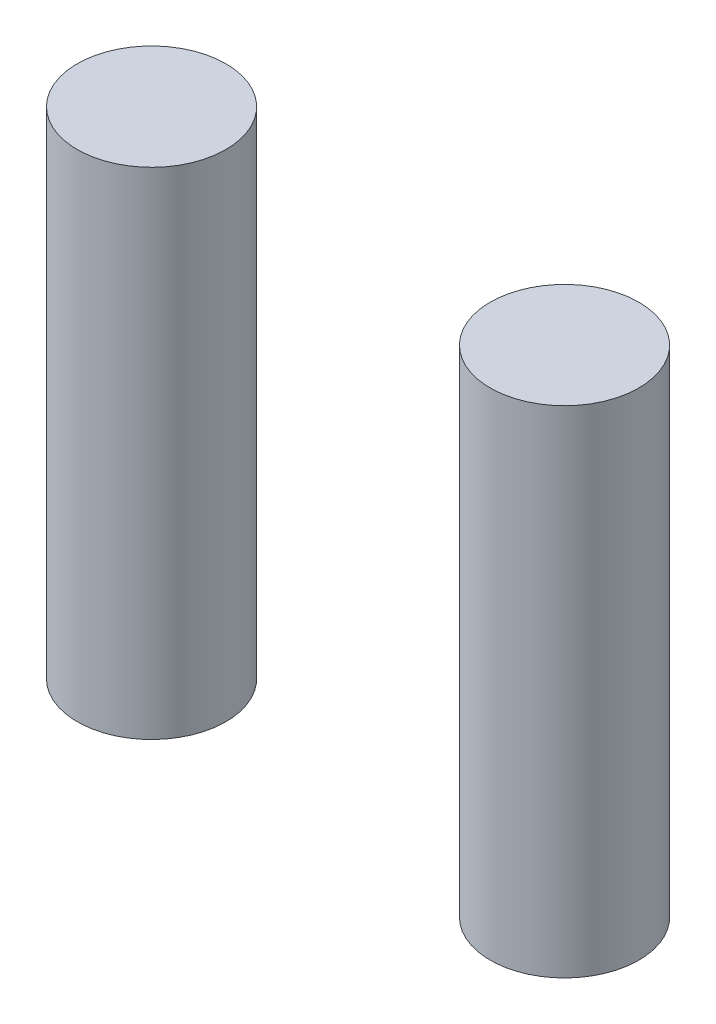
ISO-10303-21;
HEADER;
FILE_DESCRIPTION(('STEP AP214'),'2;1');
FILE_NAME('part.step','',(''),(''),'','','');
FILE_SCHEMA(('AUTOMOTIVE_DESIGN { 1 0 10303 214 1 1 1 1 }'));
ENDSEC;
DATA;
#1=APPLICATION_CONTEXT('core data for automotive mechanical design processes');
#2=APPLICATION_PROTOCOL_DEFINITION('international standard','automotive_design',2000,#1);
#3=PRODUCT_CONTEXT('',#1,'mechanical');
#4=PRODUCT('Part','Part','',(#3));
#5=PRODUCT_RELATED_PRODUCT_CATEGORY('part','',(#4));
#6=PRODUCT_DEFINITION_FORMATION('','',#4);
#7=PRODUCT_DEFINITION_CONTEXT('part definition',#1,'design');
#8=PRODUCT_DEFINITION('design','',#6,#7);
#9=PRODUCT_DEFINITION_SHAPE('','',#8);
#10=(LENGTH_UNIT() NAMED_UNIT(*) SI_UNIT(.MILLI.,.METRE.));
#11=(NAMED_UNIT(*) PLANE_ANGLE_UNIT() SI_UNIT($,.RADIAN.));
#12=(NAMED_UNIT(*) SI_UNIT($,.STERADIAN.) SOLID_ANGLE_UNIT());
#13=UNCERTAINTY_MEASURE_WITH_UNIT(LENGTH_MEASURE(1.E-05),#10,'distance_accuracy_value','');
#14=(GEOMETRIC_REPRESENTATION_CONTEXT(3) GLOBAL_UNCERTAINTY_ASSIGNED_CONTEXT((#13)) GLOBAL_UNIT_ASSIGNED_CONTEXT((#10,
#11,#12)) REPRESENTATION_CONTEXT('',''));
#15=CARTESIAN_POINT('',(0.,0.,0.));
#16=DIRECTION('',(0.,0.,1.));
#17=DIRECTION('',(1.,0.,0.));
#18=AXIS2_PLACEMENT_3D('',#15,#16,#17);
#19=CARTESIAN_POINT('',(6.35,7.62,0.));
#20=DIRECTION('',(0.,-1.,0.));
#21=DIRECTION('',(0.,0.,-1.));
#22=AXIS2_PLACEMENT_3D('',#19,#20,#21);
#23=CYLINDRICAL_SURFACE('',#22,1.143);
#24=CARTESIAN_POINT('',(6.35,7.62,0.));
#25=DIRECTION('',(0.,1.,0.));
#26=DIRECTION('',(0.,0.,1.));
#27=AXIS2_PLACEMENT_3D('',#24,#25,#26);
#28=CIRCLE('',#27,1.143);
#29=CARTESIAN_POINT('',(6.35,7.62,-1.143));
#30=VERTEX_POINT('',#29);
#31=EDGE_CURVE('E11',#30,#30,#28,.T.);
#32=CARTESIAN_POINT('',(6.35,0.,0.));
#33=DIRECTION('',(0.,1.,0.));
#34=DIRECTION('',(0.,0.,1.));
#35=AXIS2_PLACEMENT_3D('',#32,#33,#34);
#36=CIRCLE('',#35,1.143);
#37=CARTESIAN_POINT('',(6.35,0.,-1.143));
#38=VERTEX_POINT('',#37);
#39=EDGE_CURVE('E42',#38,#38,#36,.T.);
#40=CARTESIAN_POINT('',(6.35,7.62,-1.143));
#41=CARTESIAN_POINT('',(6.35,7.540625,-1.143));
#42=CARTESIAN_POINT('',(6.35,7.46125,-1.143));
#43=CARTESIAN_POINT('',(6.35,7.3025,-1.143));
#44=CARTESIAN_POINT('',(6.35,7.223125,-1.143));
#45=CARTESIAN_POINT('',(6.35,7.064375,-1.143));
#46=CARTESIAN_POINT('',(6.35,6.985,-1.143));
#47=CARTESIAN_POINT('',(6.35,6.82625,-1.143));
#48=CARTESIAN_POINT('',(6.35,6.746875,-1.143));
#49=CARTESIAN_POINT('',(6.35,6.588125,-1.143));
#50=CARTESIAN_POINT('',(6.35,6.50875,-1.143));
#51=CARTESIAN_POINT('',(6.35,6.35,-1.143));
#52=CARTESIAN_POINT('',(6.35,6.270625,-1.143));
#53=CARTESIAN_POINT('',(6.35,6.111875,-1.143));
#54=CARTESIAN_POINT('',(6.35,6.0325,-1.143));
#55=CARTESIAN_POINT('',(6.35,5.87375,-1.143));
#56=CARTESIAN_POINT('',(6.35,5.794375,-1.143));
#57=CARTESIAN_POINT('',(6.35,5.635625,-1.143));
#58=CARTESIAN_POINT('',(6.35,5.55625,-1.143));
#59=CARTESIAN_POINT('',(6.35,5.3975,-1.143));
#60=CARTESIAN_POINT('',(6.35,5.318125,-1.143));
#61=CARTESIAN_POINT('',(6.35,5.159375,-1.143));
#62=CARTESIAN_POINT('',(6.35,5.08,-1.143));
#63=CARTESIAN_POINT('',(6.35,4.92125,-1.143));
#64=CARTESIAN_POINT('',(6.35,4.841875,-1.143));
#65=CARTESIAN_POINT('',(6.35,4.683125,-1.143));
#66=CARTESIAN_POINT('',(6.35,4.60375,-1.143));
#67=CARTESIAN_POINT('',(6.35,4.445,-1.143));
#68=CARTESIAN_POINT('',(6.35,4.365625,-1.143));
#69=CARTESIAN_POINT('',(6.35,4.206875,-1.143));
#70=CARTESIAN_POINT('',(6.35,4.1275,-1.143));
#71=CARTESIAN_POINT('',(6.35,3.96875,-1.143));
#72=CARTESIAN_POINT('',(6.35,3.889375,-1.143));
#73=CARTESIAN_POINT('',(6.35,3.730625,-1.143));
#74=CARTESIAN_POINT('',(6.35,3.65125,-1.143));
#75=CARTESIAN_POINT('',(6.35,3.4925,-1.143));
#76=CARTESIAN_POINT('',(6.35,3.413125,-1.143));
#77=CARTESIAN_POINT('',(6.35,3.254375,-1.143));
#78=CARTESIAN_POINT('',(6.35,3.175,-1.143));
#79=CARTESIAN_POINT('',(6.35,3.01625,-1.143));
#80=CARTESIAN_POINT('',(6.35,2.936875,-1.143));
#81=CARTESIAN_POINT('',(6.35,2.778125,-1.143));
#82=CARTESIAN_POINT('',(6.35,2.69875,-1.143));
#83=CARTESIAN_POINT('',(6.35,2.54,-1.143));
#84=CARTESIAN_POINT('',(6.35,2.460625,-1.143));
#85=CARTESIAN_POINT('',(6.35,2.301875,-1.143));
#86=CARTESIAN_POINT('',(6.35,2.2225,-1.143));
#87=CARTESIAN_POINT('',(6.35,2.06375,-1.143));
#88=CARTESIAN_POINT('',(6.35,1.984375,-1.143));
#89=CARTESIAN_POINT('',(6.35,1.825625,-1.143));
#90=CARTESIAN_POINT('',(6.35,1.74625,-1.143));
#91=CARTESIAN_POINT('',(6.35,1.5875,-1.143));
#92=CARTESIAN_POINT('',(6.35,1.508125,-1.143));
#93=CARTESIAN_POINT('',(6.35,1.349375,-1.143));
#94=CARTESIAN_POINT('',(6.35,1.27,-1.143));
#95=CARTESIAN_POINT('',(6.35,1.11125,-1.143));
#96=CARTESIAN_POINT('',(6.35,1.031875,-1.143));
#97=CARTESIAN_POINT('',(6.35,0.873125,-1.143));
#98=CARTESIAN_POINT('',(6.35,0.79375,-1.143));
#99=CARTESIAN_POINT('',(6.35,0.635,-1.143));
#100=CARTESIAN_POINT('',(6.35,0.555625,-1.143));
#101=CARTESIAN_POINT('',(6.35,0.396875,-1.143));
#102=CARTESIAN_POINT('',(6.35,0.3175,-1.143));
#103=CARTESIAN_POINT('',(6.35,0.15875,-1.143));
#104=CARTESIAN_POINT('',(6.35,0.0793749999999999,-1.143));
#105=CARTESIAN_POINT('',(6.35,0.,-1.143));
#106=B_SPLINE_CURVE_WITH_KNOTS('',3,(#40,#41,#42,#43,#44,#45,#46,#47,#48,#49,#50,#51,#52,#53,
#54,#55,#56,#57,#58,#59,#60,#61,#62,#63,#64,#65,#66,#67,#68,#69,#70,#71,#72,#73,#74,#75,#76,#77,
#78,#79,#80,#81,#82,#83,#84,#85,#86,#87,#88,#89,#90,#91,#92,#93,#94,#95,#96,#97,#98,#99,#100,
#101,#102,#103,#104,#105),.UNSPECIFIED.,.F.,.F.,(4,2,2,2,2,2,2,2,2,2,2,2,2,2,2,2,2,2,2,2,2,2,2,
2,2,2,2,2,2,2,2,2,4),(0.,0.238125,0.476249999999999,0.714375,0.952499999999999,1.190625,1.42875,
1.666875,1.905,2.143125,2.38125,2.619375,2.8575,3.095625,3.33375,3.571875,3.81,4.048125,4.28625,
4.524375,4.7625,5.000625,5.23875,5.476875,5.715,5.953125,6.19125,6.429375,6.6675,6.905625,
7.14375,7.381875,7.62),.UNSPECIFIED.);
#107=EDGE_CURVE('BSEAM39',#30,#38,#106,.T.);
#108=ORIENTED_EDGE('',*,*,#31,.F.);
#109=ORIENTED_EDGE('',*,*,#39,.T.);
#110=ORIENTED_EDGE('',*,*,#107,.T.);
#111=ORIENTED_EDGE('',*,*,#107,.F.);
#112=EDGE_LOOP('',(#108,#110,#109,#111));
#113=FACE_BOUND('',#112,.T.);
#114=ADVANCED_FACE('F39',(#113),#23,.T.);
#115=CARTESIAN_POINT('',(6.35,7.62,0.));
#116=DIRECTION('',(0.,1.,0.));
#117=DIRECTION('',(0.,0.,1.));
#118=AXIS2_PLACEMENT_3D('',#115,#116,#117);
#119=PLANE('',#118);
#120=ORIENTED_EDGE('',*,*,#31,.T.);
#121=EDGE_LOOP('',(#120));
#122=FACE_BOUND('',#121,.T.);
#123=ADVANCED_FACE('F54',(#122),#119,.T.);
#124=CARTESIAN_POINT('',(6.35,0.,0.));
#125=DIRECTION('',(0.,1.,0.));
#126=DIRECTION('',(0.,0.,1.));
#127=AXIS2_PLACEMENT_3D('',#124,#125,#126);
#128=PLANE('',#127);
#129=ORIENTED_EDGE('',*,*,#39,.F.);
#130=EDGE_LOOP('',(#129));
#131=FACE_BOUND('',#130,.T.);
#132=ADVANCED_FACE('F52',(#131),#128,.F.);
#133=CLOSED_SHELL('',(#114,#123,#132));
#134=MANIFOLD_SOLID_BREP('B2',#133);
#135=CARTESIAN_POINT('',(0.,7.62,0.));
#136=DIRECTION('',(0.,-1.,0.));
#137=DIRECTION('',(0.,0.,-1.));
#138=AXIS2_PLACEMENT_3D('',#135,#136,#137);
#139=CYLINDRICAL_SURFACE('',#138,1.143);
#140=CARTESIAN_POINT('',(0.,7.62,0.));
#141=DIRECTION('',(0.,1.,0.));
#142=DIRECTION('',(0.,0.,1.));
#143=AXIS2_PLACEMENT_3D('',#140,#141,#142);
#144=CIRCLE('',#143,1.143);
#145=CARTESIAN_POINT('',(0.,7.62,-1.143));
#146=VERTEX_POINT('',#145);
#147=EDGE_CURVE('E38',#146,#146,#144,.T.);
#148=CARTESIAN_POINT('',(0.,0.,0.));
#149=DIRECTION('',(0.,1.,0.));
#150=DIRECTION('',(0.,0.,1.));
#151=AXIS2_PLACEMENT_3D('',#148,#149,#150);
#152=CIRCLE('',#151,1.143);
#153=CARTESIAN_POINT('',(0.,0.,-1.143));
#154=VERTEX_POINT('',#153);
#155=EDGE_CURVE('E83',#154,#154,#152,.T.);
#156=CARTESIAN_POINT('',(0.,7.62,-1.143));
#157=CARTESIAN_POINT('',(0.,7.540625,-1.143));
#158=CARTESIAN_POINT('',(0.,7.46125,-1.143));
#159=CARTESIAN_POINT('',(0.,7.3025,-1.143));
#160=CARTESIAN_POINT('',(0.,7.223125,-1.143));
#161=CARTESIAN_POINT('',(0.,7.064375,-1.143));
#162=CARTESIAN_POINT('',(0.,6.985,-1.143));
#163=CARTESIAN_POINT('',(0.,6.82625,-1.143));
#164=CARTESIAN_POINT('',(0.,6.746875,-1.143));
#165=CARTESIAN_POINT('',(0.,6.588125,-1.143));
#166=CARTESIAN_POINT('',(0.,6.50875,-1.143));
#167=CARTESIAN_POINT('',(0.,6.35,-1.143));
#168=CARTESIAN_POINT('',(0.,6.270625,-1.143));
#169=CARTESIAN_POINT('',(0.,6.111875,-1.143));
#170=CARTESIAN_POINT('',(0.,6.0325,-1.143));
#171=CARTESIAN_POINT('',(0.,5.87375,-1.143));
#172=CARTESIAN_POINT('',(0.,5.794375,-1.143));
#173=CARTESIAN_POINT('',(0.,5.635625,-1.143));
#174=CARTESIAN_POINT('',(0.,5.55625,-1.143));
#175=CARTESIAN_POINT('',(0.,5.3975,-1.143));
#176=CARTESIAN_POINT('',(0.,5.318125,-1.143));
#177=CARTESIAN_POINT('',(0.,5.159375,-1.143));
#178=CARTESIAN_POINT('',(0.,5.08,-1.143));
#179=CARTESIAN_POINT('',(0.,4.92125,-1.143));
#180=CARTESIAN_POINT('',(0.,4.841875,-1.143));
#181=CARTESIAN_POINT('',(0.,4.683125,-1.143));
#182=CARTESIAN_POINT('',(0.,4.60375,-1.143));
#183=CARTESIAN_POINT('',(0.,4.445,-1.143));
#184=CARTESIAN_POINT('',(0.,4.365625,-1.143));
#185=CARTESIAN_POINT('',(0.,4.206875,-1.143));
#186=CARTESIAN_POINT('',(0.,4.1275,-1.143));
#187=CARTESIAN_POINT('',(0.,3.96875,-1.143));
#188=CARTESIAN_POINT('',(0.,3.889375,-1.143));
#189=CARTESIAN_POINT('',(0.,3.730625,-1.143));
#190=CARTESIAN_POINT('',(0.,3.65125,-1.143));
#191=CARTESIAN_POINT('',(0.,3.4925,-1.143));
#192=CARTESIAN_POINT('',(0.,3.413125,-1.143));
#193=CARTESIAN_POINT('',(0.,3.254375,-1.143));
#194=CARTESIAN_POINT('',(0.,3.175,-1.143));
#195=CARTESIAN_POINT('',(0.,3.01625,-1.143));
#196=CARTESIAN_POINT('',(0.,2.936875,-1.143));
#197=CARTESIAN_POINT('',(0.,2.778125,-1.143));
#198=CARTESIAN_POINT('',(0.,2.69875,-1.143));
#199=CARTESIAN_POINT('',(0.,2.54,-1.143));
#200=CARTESIAN_POINT('',(0.,2.460625,-1.143));
#201=CARTESIAN_POINT('',(0.,2.301875,-1.143));
#202=CARTESIAN_POINT('',(0.,2.2225,-1.143));
#203=CARTESIAN_POINT('',(0.,2.06375,-1.143));
#204=CARTESIAN_POINT('',(0.,1.984375,-1.143));
#205=CARTESIAN_POINT('',(0.,1.825625,-1.143));
#206=CARTESIAN_POINT('',(0.,1.74625,-1.143));
#207=CARTESIAN_POINT('',(0.,1.5875,-1.143));
#208=CARTESIAN_POINT('',(0.,1.508125,-1.143));
#209=CARTESIAN_POINT('',(0.,1.349375,-1.143));
#210=CARTESIAN_POINT('',(0.,1.27,-1.143));
#211=CARTESIAN_POINT('',(0.,1.11125,-1.143));
#212=CARTESIAN_POINT('',(0.,1.031875,-1.143));
#213=CARTESIAN_POINT('',(0.,0.873125,-1.143));
#214=CARTESIAN_POINT('',(0.,0.79375,-1.143));
#215=CARTESIAN_POINT('',(0.,0.635,-1.143));
#216=CARTESIAN_POINT('',(0.,0.555625,-1.143));
#217=CARTESIAN_POINT('',(0.,0.396875,-1.143));
#218=CARTESIAN_POINT('',(0.,0.3175,-1.143));
#219=CARTESIAN_POINT('',(0.,0.15875,-1.143));
#220=CARTESIAN_POINT('',(0.,0.0793749999999999,-1.143));
#221=CARTESIAN_POINT('',(0.,0.,-1.143));
#222=B_SPLINE_CURVE_WITH_KNOTS('',3,(#156,#157,#158,#159,#160,#161,#162,#163,#164,#165,#166,
#167,#168,#169,#170,#171,#172,#173,#174,#175,#176,#177,#178,#179,#180,#181,#182,#183,#184,#185,
#186,#187,#188,#189,#190,#191,#192,#193,#194,#195,#196,#197,#198,#199,#200,#201,#202,#203,#204,
#205,#206,#207,#208,#209,#210,#211,#212,#213,#214,#215,#216,#217,#218,#219,#220,#221),
.UNSPECIFIED.,.F.,.F.,(4,2,2,2,2,2,2,2,2,2,2,2,2,2,2,2,2,2,2,2,2,2,2,2,2,2,2,2,2,2,2,2,4),(0.,
0.238125,0.476249999999999,0.714375,0.952499999999999,1.190625,1.42875,1.666875,1.905,2.143125,
2.38125,2.619375,2.8575,3.095625,3.33375,3.571875,3.81,4.048125,4.28625,4.524375,4.7625,
5.000625,5.23875,5.476875,5.715,5.953125,6.19125,6.429375,6.6675,6.905625,7.14375,7.381875,
7.62),.UNSPECIFIED.);
#223=EDGE_CURVE('BSEAM80',#146,#154,#222,.T.);
#224=ORIENTED_EDGE('',*,*,#147,.F.);
#225=ORIENTED_EDGE('',*,*,#155,.T.);
#226=ORIENTED_EDGE('',*,*,#223,.T.);
#227=ORIENTED_EDGE('',*,*,#223,.F.);
#228=EDGE_LOOP('',(#224,#226,#225,#227));
#229=FACE_BOUND('',#228,.T.);
#230=ADVANCED_FACE('F80',(#229),#139,.T.);
#231=CARTESIAN_POINT('',(0.,7.62,0.));
#232=DIRECTION('',(0.,1.,0.));
#233=DIRECTION('',(0.,0.,1.));
#234=AXIS2_PLACEMENT_3D('',#231,#232,#233);
#235=PLANE('',#234);
#236=ORIENTED_EDGE('',*,*,#147,.T.);
#237=EDGE_LOOP('',(#236));
#238=FACE_BOUND('',#237,.T.);
#239=ADVANCED_FACE('F95',(#238),#235,.T.);
#240=CARTESIAN_POINT('',(0.,0.,0.));
#241=DIRECTION('',(0.,1.,0.));
#242=DIRECTION('',(0.,0.,1.));
#243=AXIS2_PLACEMENT_3D('',#240,#241,#242);
#244=PLANE('',#243);
#245=ORIENTED_EDGE('',*,*,#155,.F.);
#246=EDGE_LOOP('',(#245));
#247=FACE_BOUND('',#246,.T.);
#248=ADVANCED_FACE('F93',(#247),#244,.F.);
#249=CLOSED_SHELL('',(#230,#239,#248));
#250=MANIFOLD_SOLID_BREP('B6',#249);
#251=ADVANCED_BREP_SHAPE_REPRESENTATION('',(#18,#134,#250),#14);
#252=SHAPE_DEFINITION_REPRESENTATION(#9,#251);
ENDSEC;
END-ISO-10303-21;
